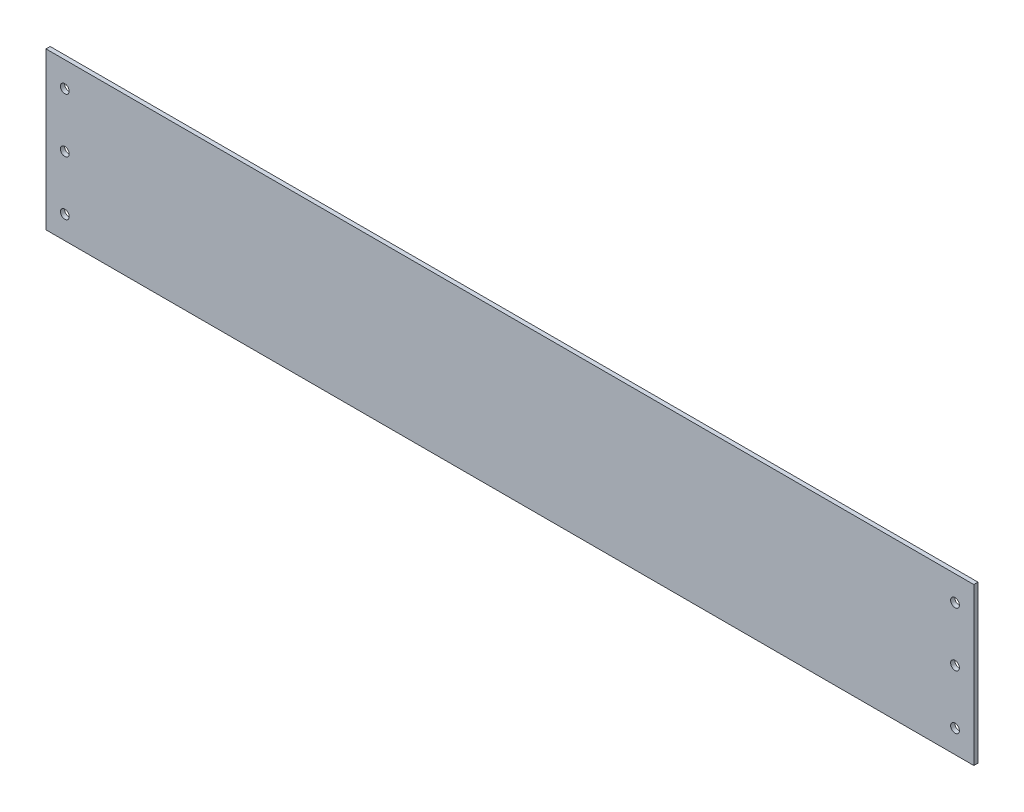
ISO-10303-21;
HEADER;
FILE_DESCRIPTION(('STEP AP214'),'2;1');
FILE_NAME('part.step','',(''),(''),'','','');
FILE_SCHEMA(('AUTOMOTIVE_DESIGN { 1 0 10303 214 1 1 1 1 }'));
ENDSEC;
DATA;
#1=APPLICATION_CONTEXT('core data for automotive mechanical design processes');
#2=APPLICATION_PROTOCOL_DEFINITION('international standard','automotive_design',2000,#1);
#3=PRODUCT_CONTEXT('',#1,'mechanical');
#4=PRODUCT('Part','Part','',(#3));
#5=PRODUCT_RELATED_PRODUCT_CATEGORY('part','',(#4));
#6=PRODUCT_DEFINITION_FORMATION('','',#4);
#7=PRODUCT_DEFINITION_CONTEXT('part definition',#1,'design');
#8=PRODUCT_DEFINITION('design','',#6,#7);
#9=PRODUCT_DEFINITION_SHAPE('','',#8);
#10=(LENGTH_UNIT() NAMED_UNIT(*) SI_UNIT(.MILLI.,.METRE.));
#11=(NAMED_UNIT(*) PLANE_ANGLE_UNIT() SI_UNIT($,.RADIAN.));
#12=(NAMED_UNIT(*) SI_UNIT($,.STERADIAN.) SOLID_ANGLE_UNIT());
#13=UNCERTAINTY_MEASURE_WITH_UNIT(LENGTH_MEASURE(1.E-05),#10,'distance_accuracy_value','');
#14=(GEOMETRIC_REPRESENTATION_CONTEXT(3) GLOBAL_UNCERTAINTY_ASSIGNED_CONTEXT((#13)) GLOBAL_UNIT_ASSIGNED_CONTEXT((#10,
#11,#12)) REPRESENTATION_CONTEXT('',''));
#15=CARTESIAN_POINT('',(0.,0.,0.));
#16=DIRECTION('',(0.,0.,1.));
#17=DIRECTION('',(1.,0.,0.));
#18=AXIS2_PLACEMENT_3D('',#15,#16,#17);
#19=CARTESIAN_POINT('',(0.,37.4999999999996,1.));
#20=DIRECTION('',(0.,0.,-1.));
#21=DIRECTION('',(-1.,0.,0.));
#22=AXIS2_PLACEMENT_3D('',#19,#20,#21);
#23=PLANE('',#22);
#24=CARTESIAN_POINT('',(217.5,18.5,1.));
#25=DIRECTION('',(0.,0.,1.));
#26=DIRECTION('',(-1.,0.,0.));
#27=AXIS2_PLACEMENT_3D('',#24,#25,#26);
#28=CIRCLE('',#27,1.05000000000002);
#29=CARTESIAN_POINT('',(216.45,18.5,1.));
#30=VERTEX_POINT('',#29);
#31=EDGE_CURVE('E134',#30,#30,#28,.T.);
#32=ORIENTED_EDGE('',*,*,#31,.F.);
#33=EDGE_LOOP('',(#32));
#34=FACE_BOUND('',#33,.T.);
#35=CARTESIAN_POINT('',(4.5,5.5,1.));
#36=DIRECTION('',(0.,0.,1.));
#37=DIRECTION('',(1.,0.,0.));
#38=AXIS2_PLACEMENT_3D('',#35,#36,#37);
#39=CIRCLE('',#38,1.05);
#40=CARTESIAN_POINT('',(5.55,5.5,1.));
#41=VERTEX_POINT('',#40);
#42=EDGE_CURVE('E122',#41,#41,#39,.T.);
#43=ORIENTED_EDGE('',*,*,#42,.F.);
#44=EDGE_LOOP('',(#43));
#45=FACE_BOUND('',#44,.T.);
#46=CARTESIAN_POINT('',(4.5,31.5,1.));
#47=DIRECTION('',(0.,0.,1.));
#48=DIRECTION('',(1.,0.,0.));
#49=AXIS2_PLACEMENT_3D('',#46,#47,#48);
#50=CIRCLE('',#49,1.05);
#51=CARTESIAN_POINT('',(5.55,31.5,1.));
#52=VERTEX_POINT('',#51);
#53=EDGE_CURVE('E101',#52,#52,#50,.T.);
#54=ORIENTED_EDGE('',*,*,#53,.F.);
#55=EDGE_LOOP('',(#54));
#56=FACE_BOUND('',#55,.T.);
#57=DIRECTION('',(0.,-1.,0.));
#58=VECTOR('',#57,1.);
#59=CARTESIAN_POINT('',(0.,0.,1.));
#60=LINE('',#59,#58);
#61=CARTESIAN_POINT('',(0.,37.4999999999996,1.));
#62=VERTEX_POINT('',#61);
#63=CARTESIAN_POINT('',(0.,0.,1.));
#64=VERTEX_POINT('',#63);
#65=EDGE_CURVE('E86',#62,#64,#60,.T.);
#66=ORIENTED_EDGE('',*,*,#65,.T.);
#67=DIRECTION('',(1.,0.,0.));
#68=VECTOR('',#67,1.);
#69=CARTESIAN_POINT('',(0.,0.,1.));
#70=LINE('',#69,#68);
#71=CARTESIAN_POINT('',(222.,0.,1.));
#72=VERTEX_POINT('',#71);
#73=EDGE_CURVE('E81',#64,#72,#70,.T.);
#74=ORIENTED_EDGE('',*,*,#73,.T.);
#75=DIRECTION('',(0.,1.,0.));
#76=VECTOR('',#75,1.);
#77=CARTESIAN_POINT('',(222.,0.,1.));
#78=LINE('',#77,#76);
#79=CARTESIAN_POINT('',(222.,37.5,1.));
#80=VERTEX_POINT('',#79);
#81=EDGE_CURVE('E84',#72,#80,#78,.T.);
#82=ORIENTED_EDGE('',*,*,#81,.T.);
#83=DIRECTION('',(-1.,0.,0.));
#84=VECTOR('',#83,1.);
#85=CARTESIAN_POINT('',(0.,37.4999999999996,1.));
#86=LINE('',#85,#84);
#87=EDGE_CURVE('E51',#80,#62,#86,.T.);
#88=ORIENTED_EDGE('',*,*,#87,.T.);
#89=EDGE_LOOP('',(#66,#74,#82,#88));
#90=FACE_BOUND('',#89,.T.);
#91=CARTESIAN_POINT('',(4.5,18.5,1.));
#92=DIRECTION('',(0.,0.,1.));
#93=DIRECTION('',(1.,0.,0.));
#94=AXIS2_PLACEMENT_3D('',#91,#92,#93);
#95=CIRCLE('',#94,1.05);
#96=CARTESIAN_POINT('',(5.55,18.5,1.));
#97=VERTEX_POINT('',#96);
#98=EDGE_CURVE('E116',#97,#97,#95,.T.);
#99=ORIENTED_EDGE('',*,*,#98,.F.);
#100=EDGE_LOOP('',(#99));
#101=FACE_BOUND('',#100,.T.);
#102=CARTESIAN_POINT('',(217.5,5.50000000000003,1.));
#103=DIRECTION('',(0.,0.,1.));
#104=DIRECTION('',(-1.,0.,0.));
#105=AXIS2_PLACEMENT_3D('',#102,#103,#104);
#106=CIRCLE('',#105,1.04999999999999);
#107=CARTESIAN_POINT('',(216.45,5.50000000000003,1.));
#108=VERTEX_POINT('',#107);
#109=EDGE_CURVE('E128',#108,#108,#106,.T.);
#110=ORIENTED_EDGE('',*,*,#109,.F.);
#111=EDGE_LOOP('',(#110));
#112=FACE_BOUND('',#111,.T.);
#113=CARTESIAN_POINT('',(217.5,31.5,1.));
#114=DIRECTION('',(0.,0.,1.));
#115=DIRECTION('',(-1.,0.,0.));
#116=AXIS2_PLACEMENT_3D('',#113,#114,#115);
#117=CIRCLE('',#116,1.04999999999999);
#118=CARTESIAN_POINT('',(216.45,31.5,1.));
#119=VERTEX_POINT('',#118);
#120=EDGE_CURVE('E140',#119,#119,#117,.T.);
#121=ORIENTED_EDGE('',*,*,#120,.F.);
#122=EDGE_LOOP('',(#121));
#123=FACE_BOUND('',#122,.T.);
#124=ADVANCED_FACE('F34',(#34,#45,#56,#90,#101,#112,#123),#23,.F.);
#125=CARTESIAN_POINT('',(0.,37.4999999999996,0.));
#126=DIRECTION('',(0.,0.,-1.));
#127=DIRECTION('',(-1.,0.,0.));
#128=AXIS2_PLACEMENT_3D('',#125,#126,#127);
#129=PLANE('',#128);
#130=CARTESIAN_POINT('',(217.5,18.5,0.));
#131=DIRECTION('',(0.,0.,1.));
#132=DIRECTION('',(-1.,0.,0.));
#133=AXIS2_PLACEMENT_3D('',#130,#131,#132);
#134=CIRCLE('',#133,1.05000000000002);
#135=CARTESIAN_POINT('',(216.45,18.5,0.));
#136=VERTEX_POINT('',#135);
#137=EDGE_CURVE('E137',#136,#136,#134,.T.);
#138=ORIENTED_EDGE('',*,*,#137,.T.);
#139=EDGE_LOOP('',(#138));
#140=FACE_BOUND('',#139,.T.);
#141=CARTESIAN_POINT('',(4.5,5.5,0.));
#142=DIRECTION('',(0.,0.,1.));
#143=DIRECTION('',(1.,0.,0.));
#144=AXIS2_PLACEMENT_3D('',#141,#142,#143);
#145=CIRCLE('',#144,1.05);
#146=CARTESIAN_POINT('',(5.55,5.5,0.));
#147=VERTEX_POINT('',#146);
#148=EDGE_CURVE('E125',#147,#147,#145,.T.);
#149=ORIENTED_EDGE('',*,*,#148,.T.);
#150=EDGE_LOOP('',(#149));
#151=FACE_BOUND('',#150,.T.);
#152=CARTESIAN_POINT('',(4.5,31.5,0.));
#153=DIRECTION('',(0.,0.,1.));
#154=DIRECTION('',(1.,0.,0.));
#155=AXIS2_PLACEMENT_3D('',#152,#153,#154);
#156=CIRCLE('',#155,1.05);
#157=CARTESIAN_POINT('',(5.55,31.5,0.));
#158=VERTEX_POINT('',#157);
#159=EDGE_CURVE('E113',#158,#158,#156,.T.);
#160=ORIENTED_EDGE('',*,*,#159,.T.);
#161=EDGE_LOOP('',(#160));
#162=FACE_BOUND('',#161,.T.);
#163=DIRECTION('',(0.,-1.,0.));
#164=VECTOR('',#163,1.);
#165=CARTESIAN_POINT('',(0.,0.,0.));
#166=LINE('',#165,#164);
#167=CARTESIAN_POINT('',(0.,37.4999999999996,0.));
#168=VERTEX_POINT('',#167);
#169=CARTESIAN_POINT('',(0.,0.,0.));
#170=VERTEX_POINT('',#169);
#171=EDGE_CURVE('E98',#168,#170,#166,.T.);
#172=ORIENTED_EDGE('',*,*,#171,.F.);
#173=DIRECTION('',(-1.,0.,0.));
#174=VECTOR('',#173,1.);
#175=CARTESIAN_POINT('',(0.,37.4999999999996,0.));
#176=LINE('',#175,#174);
#177=CARTESIAN_POINT('',(222.,37.5,0.));
#178=VERTEX_POINT('',#177);
#179=EDGE_CURVE('E74',#178,#168,#176,.T.);
#180=ORIENTED_EDGE('',*,*,#179,.F.);
#181=DIRECTION('',(0.,1.,0.));
#182=VECTOR('',#181,1.);
#183=CARTESIAN_POINT('',(222.,0.,0.));
#184=LINE('',#183,#182);
#185=CARTESIAN_POINT('',(222.,0.,0.));
#186=VERTEX_POINT('',#185);
#187=EDGE_CURVE('E68',#186,#178,#184,.T.);
#188=ORIENTED_EDGE('',*,*,#187,.F.);
#189=DIRECTION('',(1.,0.,0.));
#190=VECTOR('',#189,1.);
#191=CARTESIAN_POINT('',(0.,0.,0.));
#192=LINE('',#191,#190);
#193=EDGE_CURVE('E90',#170,#186,#192,.T.);
#194=ORIENTED_EDGE('',*,*,#193,.F.);
#195=EDGE_LOOP('',(#172,#180,#188,#194));
#196=FACE_BOUND('',#195,.T.);
#197=CARTESIAN_POINT('',(4.5,18.5,0.));
#198=DIRECTION('',(0.,0.,1.));
#199=DIRECTION('',(1.,0.,0.));
#200=AXIS2_PLACEMENT_3D('',#197,#198,#199);
#201=CIRCLE('',#200,1.05);
#202=CARTESIAN_POINT('',(5.55,18.5,0.));
#203=VERTEX_POINT('',#202);
#204=EDGE_CURVE('E119',#203,#203,#201,.T.);
#205=ORIENTED_EDGE('',*,*,#204,.T.);
#206=EDGE_LOOP('',(#205));
#207=FACE_BOUND('',#206,.T.);
#208=CARTESIAN_POINT('',(217.5,5.50000000000003,0.));
#209=DIRECTION('',(0.,0.,1.));
#210=DIRECTION('',(-1.,0.,0.));
#211=AXIS2_PLACEMENT_3D('',#208,#209,#210);
#212=CIRCLE('',#211,1.04999999999999);
#213=CARTESIAN_POINT('',(216.45,5.50000000000003,0.));
#214=VERTEX_POINT('',#213);
#215=EDGE_CURVE('E131',#214,#214,#212,.T.);
#216=ORIENTED_EDGE('',*,*,#215,.T.);
#217=EDGE_LOOP('',(#216));
#218=FACE_BOUND('',#217,.T.);
#219=CARTESIAN_POINT('',(217.5,31.5,0.));
#220=DIRECTION('',(0.,0.,1.));
#221=DIRECTION('',(-1.,0.,0.));
#222=AXIS2_PLACEMENT_3D('',#219,#220,#221);
#223=CIRCLE('',#222,1.04999999999999);
#224=CARTESIAN_POINT('',(216.45,31.5,0.));
#225=VERTEX_POINT('',#224);
#226=EDGE_CURVE('E143',#225,#225,#223,.T.);
#227=ORIENTED_EDGE('',*,*,#226,.T.);
#228=EDGE_LOOP('',(#227));
#229=FACE_BOUND('',#228,.T.);
#230=ADVANCED_FACE('F109',(#140,#151,#162,#196,#207,#218,#229),#129,.T.);
#231=CARTESIAN_POINT('',(0.,0.,1.));
#232=DIRECTION('',(1.,0.,0.));
#233=DIRECTION('',(0.,0.,-1.));
#234=AXIS2_PLACEMENT_3D('',#231,#232,#233);
#235=PLANE('',#234);
#236=ORIENTED_EDGE('',*,*,#171,.T.);
#237=DIRECTION('',(0.,0.,-1.));
#238=VECTOR('',#237,1.);
#239=CARTESIAN_POINT('',(0.,0.,1.));
#240=LINE('',#239,#238);
#241=EDGE_CURVE('E11',#64,#170,#240,.T.);
#242=ORIENTED_EDGE('',*,*,#241,.F.);
#243=ORIENTED_EDGE('',*,*,#65,.F.);
#244=DIRECTION('',(0.,0.,-1.));
#245=VECTOR('',#244,1.);
#246=CARTESIAN_POINT('',(0.,37.4999999999996,1.));
#247=LINE('',#246,#245);
#248=EDGE_CURVE('E94',#62,#168,#247,.T.);
#249=ORIENTED_EDGE('',*,*,#248,.T.);
#250=EDGE_LOOP('',(#236,#242,#243,#249));
#251=FACE_BOUND('',#250,.T.);
#252=ADVANCED_FACE('F36',(#251),#235,.F.);
#253=CARTESIAN_POINT('',(0.,0.,1.));
#254=DIRECTION('',(0.,1.,0.));
#255=DIRECTION('',(-1.,0.,0.));
#256=AXIS2_PLACEMENT_3D('',#253,#254,#255);
#257=PLANE('',#256);
#258=ORIENTED_EDGE('',*,*,#193,.T.);
#259=DIRECTION('',(0.,0.,-1.));
#260=VECTOR('',#259,1.);
#261=CARTESIAN_POINT('',(222.,0.,1.));
#262=LINE('',#261,#260);
#263=EDGE_CURVE('E43',#72,#186,#262,.T.);
#264=ORIENTED_EDGE('',*,*,#263,.F.);
#265=ORIENTED_EDGE('',*,*,#73,.F.);
#266=ORIENTED_EDGE('',*,*,#241,.T.);
#267=EDGE_LOOP('',(#258,#264,#265,#266));
#268=FACE_BOUND('',#267,.T.);
#269=ADVANCED_FACE('F89',(#268),#257,.F.);
#270=CARTESIAN_POINT('',(222.,0.,1.));
#271=DIRECTION('',(-1.,0.,0.));
#272=DIRECTION('',(0.,0.,1.));
#273=AXIS2_PLACEMENT_3D('',#270,#271,#272);
#274=PLANE('',#273);
#275=ORIENTED_EDGE('',*,*,#187,.T.);
#276=DIRECTION('',(0.,0.,-1.));
#277=VECTOR('',#276,1.);
#278=CARTESIAN_POINT('',(222.,37.5,1.));
#279=LINE('',#278,#277);
#280=EDGE_CURVE('E91',#80,#178,#279,.T.);
#281=ORIENTED_EDGE('',*,*,#280,.F.);
#282=ORIENTED_EDGE('',*,*,#81,.F.);
#283=ORIENTED_EDGE('',*,*,#263,.T.);
#284=EDGE_LOOP('',(#275,#281,#282,#283));
#285=FACE_BOUND('',#284,.T.);
#286=ADVANCED_FACE('F92',(#285),#274,.F.);
#287=CARTESIAN_POINT('',(0.,37.4999999999996,1.));
#288=DIRECTION('',(0.,-1.,0.));
#289=DIRECTION('',(1.,0.,0.));
#290=AXIS2_PLACEMENT_3D('',#287,#288,#289);
#291=PLANE('',#290);
#292=ORIENTED_EDGE('',*,*,#179,.T.);
#293=ORIENTED_EDGE('',*,*,#248,.F.);
#294=ORIENTED_EDGE('',*,*,#87,.F.);
#295=ORIENTED_EDGE('',*,*,#280,.T.);
#296=EDGE_LOOP('',(#292,#293,#294,#295));
#297=FACE_BOUND('',#296,.T.);
#298=ADVANCED_FACE('F106',(#297),#291,.F.);
#299=CARTESIAN_POINT('',(4.5,31.5,1.));
#300=DIRECTION('',(0.,0.,-1.));
#301=DIRECTION('',(-1.,0.,0.));
#302=AXIS2_PLACEMENT_3D('',#299,#300,#301);
#303=CYLINDRICAL_SURFACE('',#302,1.05);
#304=ORIENTED_EDGE('',*,*,#53,.T.);
#305=EDGE_LOOP('',(#304));
#306=FACE_BOUND('',#305,.T.);
#307=ORIENTED_EDGE('',*,*,#159,.F.);
#308=EDGE_LOOP('',(#307));
#309=FACE_BOUND('',#308,.T.);
#310=ADVANCED_FACE('F163',(#306,#309),#303,.F.);
#311=CARTESIAN_POINT('',(4.5,18.5,1.));
#312=DIRECTION('',(0.,0.,-1.));
#313=DIRECTION('',(-1.,0.,0.));
#314=AXIS2_PLACEMENT_3D('',#311,#312,#313);
#315=CYLINDRICAL_SURFACE('',#314,1.05);
#316=ORIENTED_EDGE('',*,*,#98,.T.);
#317=EDGE_LOOP('',(#316));
#318=FACE_BOUND('',#317,.T.);
#319=ORIENTED_EDGE('',*,*,#204,.F.);
#320=EDGE_LOOP('',(#319));
#321=FACE_BOUND('',#320,.T.);
#322=ADVANCED_FACE('F209',(#318,#321),#315,.F.);
#323=CARTESIAN_POINT('',(4.5,5.5,1.));
#324=DIRECTION('',(0.,0.,-1.));
#325=DIRECTION('',(-1.,0.,0.));
#326=AXIS2_PLACEMENT_3D('',#323,#324,#325);
#327=CYLINDRICAL_SURFACE('',#326,1.05);
#328=ORIENTED_EDGE('',*,*,#42,.T.);
#329=EDGE_LOOP('',(#328));
#330=FACE_BOUND('',#329,.T.);
#331=ORIENTED_EDGE('',*,*,#148,.F.);
#332=EDGE_LOOP('',(#331));
#333=FACE_BOUND('',#332,.T.);
#334=ADVANCED_FACE('F217',(#330,#333),#327,.F.);
#335=CARTESIAN_POINT('',(217.5,5.50000000000003,1.));
#336=DIRECTION('',(0.,0.,-1.));
#337=DIRECTION('',(-1.,0.,0.));
#338=AXIS2_PLACEMENT_3D('',#335,#336,#337);
#339=CYLINDRICAL_SURFACE('',#338,1.04999999999999);
#340=ORIENTED_EDGE('',*,*,#109,.T.);
#341=EDGE_LOOP('',(#340));
#342=FACE_BOUND('',#341,.T.);
#343=ORIENTED_EDGE('',*,*,#215,.F.);
#344=EDGE_LOOP('',(#343));
#345=FACE_BOUND('',#344,.T.);
#346=ADVANCED_FACE('F225',(#342,#345),#339,.F.);
#347=CARTESIAN_POINT('',(217.5,18.5,1.));
#348=DIRECTION('',(0.,0.,-1.));
#349=DIRECTION('',(-1.,0.,0.));
#350=AXIS2_PLACEMENT_3D('',#347,#348,#349);
#351=CYLINDRICAL_SURFACE('',#350,1.05000000000002);
#352=ORIENTED_EDGE('',*,*,#31,.T.);
#353=EDGE_LOOP('',(#352));
#354=FACE_BOUND('',#353,.T.);
#355=ORIENTED_EDGE('',*,*,#137,.F.);
#356=EDGE_LOOP('',(#355));
#357=FACE_BOUND('',#356,.T.);
#358=ADVANCED_FACE('F234',(#354,#357),#351,.F.);
#359=CARTESIAN_POINT('',(217.5,31.5,1.));
#360=DIRECTION('',(0.,0.,-1.));
#361=DIRECTION('',(-1.,0.,0.));
#362=AXIS2_PLACEMENT_3D('',#359,#360,#361);
#363=CYLINDRICAL_SURFACE('',#362,1.04999999999999);
#364=ORIENTED_EDGE('',*,*,#120,.T.);
#365=EDGE_LOOP('',(#364));
#366=FACE_BOUND('',#365,.T.);
#367=ORIENTED_EDGE('',*,*,#226,.F.);
#368=EDGE_LOOP('',(#367));
#369=FACE_BOUND('',#368,.T.);
#370=ADVANCED_FACE('F149',(#366,#369),#363,.F.);
#371=CLOSED_SHELL('',(#124,#230,#252,#269,#286,#298,#310,#322,#334,#346,#358,#370));
#372=MANIFOLD_SOLID_BREP('B2',#371);
#373=ADVANCED_BREP_SHAPE_REPRESENTATION('',(#18,#372),#14);
#374=SHAPE_DEFINITION_REPRESENTATION(#9,#373);
ENDSEC;
END-ISO-10303-21;
